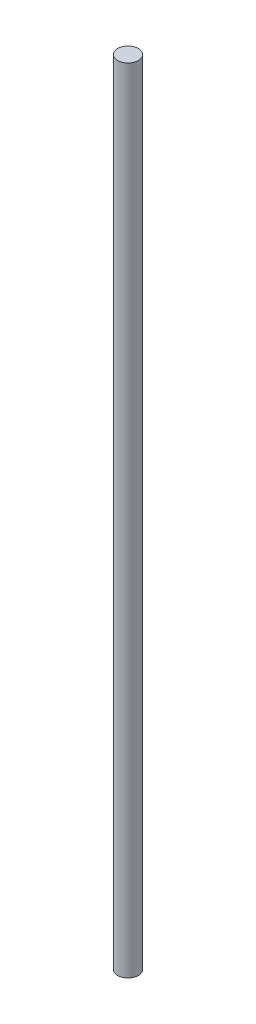
ISO-10303-21;
HEADER;
FILE_DESCRIPTION(('STEP AP214'),'2;1');
FILE_NAME('part.step','',(''),(''),'','','');
FILE_SCHEMA(('AUTOMOTIVE_DESIGN { 1 0 10303 214 1 1 1 1 }'));
ENDSEC;
DATA;
#1=APPLICATION_CONTEXT('core data for automotive mechanical design processes');
#2=APPLICATION_PROTOCOL_DEFINITION('international standard','automotive_design',2000,#1);
#3=PRODUCT_CONTEXT('',#1,'mechanical');
#4=PRODUCT('Part','Part','',(#3));
#5=PRODUCT_RELATED_PRODUCT_CATEGORY('part','',(#4));
#6=PRODUCT_DEFINITION_FORMATION('','',#4);
#7=PRODUCT_DEFINITION_CONTEXT('part definition',#1,'design');
#8=PRODUCT_DEFINITION('design','',#6,#7);
#9=PRODUCT_DEFINITION_SHAPE('','',#8);
#10=(LENGTH_UNIT() NAMED_UNIT(*) SI_UNIT(.MILLI.,.METRE.));
#11=(NAMED_UNIT(*) PLANE_ANGLE_UNIT() SI_UNIT($,.RADIAN.));
#12=(NAMED_UNIT(*) SI_UNIT($,.STERADIAN.) SOLID_ANGLE_UNIT());
#13=UNCERTAINTY_MEASURE_WITH_UNIT(LENGTH_MEASURE(1.E-05),#10,'distance_accuracy_value','');
#14=(GEOMETRIC_REPRESENTATION_CONTEXT(3) GLOBAL_UNCERTAINTY_ASSIGNED_CONTEXT((#13)) GLOBAL_UNIT_ASSIGNED_CONTEXT((#10,
#11,#12)) REPRESENTATION_CONTEXT('',''));
#15=CARTESIAN_POINT('',(0.,0.,0.));
#16=DIRECTION('',(0.,0.,1.));
#17=DIRECTION('',(1.,0.,0.));
#18=AXIS2_PLACEMENT_3D('',#15,#16,#17);
#19=CARTESIAN_POINT('',(0.,457.,0.));
#20=DIRECTION('',(0.,-1.,0.));
#21=DIRECTION('',(0.,0.,-1.));
#22=AXIS2_PLACEMENT_3D('',#19,#20,#21);
#23=CYLINDRICAL_SURFACE('',#22,6.);
#24=CARTESIAN_POINT('',(0.,457.,0.));
#25=DIRECTION('',(0.,1.,0.));
#26=DIRECTION('',(0.,0.,1.));
#27=AXIS2_PLACEMENT_3D('',#24,#25,#26);
#28=CIRCLE('',#27,6.);
#29=CARTESIAN_POINT('',(0.,457.,6.));
#30=VERTEX_POINT('',#29);
#31=EDGE_CURVE('E10',#30,#30,#28,.T.);
#32=ORIENTED_EDGE('',*,*,#31,.F.);
#33=EDGE_LOOP('',(#32));
#34=FACE_BOUND('',#33,.T.);
#35=CARTESIAN_POINT('',(0.,0.,0.));
#36=DIRECTION('',(0.,1.,0.));
#37=DIRECTION('',(0.,0.,1.));
#38=AXIS2_PLACEMENT_3D('',#35,#36,#37);
#39=CIRCLE('',#38,6.);
#40=CARTESIAN_POINT('',(0.,0.,6.));
#41=VERTEX_POINT('',#40);
#42=EDGE_CURVE('E34',#41,#41,#39,.T.);
#43=ORIENTED_EDGE('',*,*,#42,.T.);
#44=EDGE_LOOP('',(#43));
#45=FACE_BOUND('',#44,.T.);
#46=ADVANCED_FACE('F31',(#34,#45),#23,.T.);
#47=CARTESIAN_POINT('',(0.,457.,0.));
#48=DIRECTION('',(0.,1.,0.));
#49=DIRECTION('',(0.,0.,1.));
#50=AXIS2_PLACEMENT_3D('',#47,#48,#49);
#51=PLANE('',#50);
#52=ORIENTED_EDGE('',*,*,#31,.T.);
#53=EDGE_LOOP('',(#52));
#54=FACE_BOUND('',#53,.T.);
#55=ADVANCED_FACE('F46',(#54),#51,.T.);
#56=CARTESIAN_POINT('',(0.,0.,0.));
#57=DIRECTION('',(0.,1.,0.));
#58=DIRECTION('',(0.,0.,1.));
#59=AXIS2_PLACEMENT_3D('',#56,#57,#58);
#60=PLANE('',#59);
#61=ORIENTED_EDGE('',*,*,#42,.F.);
#62=EDGE_LOOP('',(#61));
#63=FACE_BOUND('',#62,.T.);
#64=ADVANCED_FACE('F44',(#63),#60,.F.);
#65=CLOSED_SHELL('',(#46,#55,#64));
#66=MANIFOLD_SOLID_BREP('B2',#65);
#67=ADVANCED_BREP_SHAPE_REPRESENTATION('',(#18,#66),#14);
#68=SHAPE_DEFINITION_REPRESENTATION(#9,#67);
ENDSEC;
END-ISO-10303-21;
